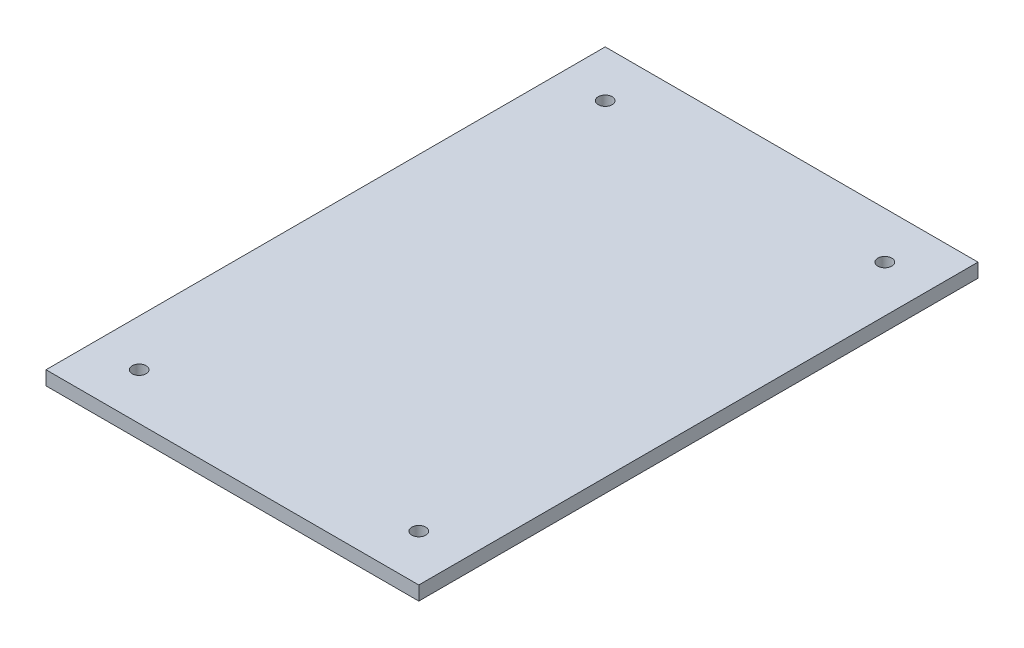
ISO-10303-21;
HEADER;
FILE_DESCRIPTION(('STEP AP214'),'2;1');
FILE_NAME('part.step','',(''),(''),'','','');
FILE_SCHEMA(('AUTOMOTIVE_DESIGN { 1 0 10303 214 1 1 1 1 }'));
ENDSEC;
DATA;
#1=APPLICATION_CONTEXT('core data for automotive mechanical design processes');
#2=APPLICATION_PROTOCOL_DEFINITION('international standard','automotive_design',2000,#1);
#3=PRODUCT_CONTEXT('',#1,'mechanical');
#4=PRODUCT('Part','Part','',(#3));
#5=PRODUCT_RELATED_PRODUCT_CATEGORY('part','',(#4));
#6=PRODUCT_DEFINITION_FORMATION('','',#4);
#7=PRODUCT_DEFINITION_CONTEXT('part definition',#1,'design');
#8=PRODUCT_DEFINITION('design','',#6,#7);
#9=PRODUCT_DEFINITION_SHAPE('','',#8);
#10=(LENGTH_UNIT() NAMED_UNIT(*) SI_UNIT(.MILLI.,.METRE.));
#11=(NAMED_UNIT(*) PLANE_ANGLE_UNIT() SI_UNIT($,.RADIAN.));
#12=(NAMED_UNIT(*) SI_UNIT($,.STERADIAN.) SOLID_ANGLE_UNIT());
#13=UNCERTAINTY_MEASURE_WITH_UNIT(LENGTH_MEASURE(1.E-05),#10,'distance_accuracy_value','');
#14=(GEOMETRIC_REPRESENTATION_CONTEXT(3) GLOBAL_UNCERTAINTY_ASSIGNED_CONTEXT((#13)) GLOBAL_UNIT_ASSIGNED_CONTEXT((#10,
#11,#12)) REPRESENTATION_CONTEXT('',''));
#15=CARTESIAN_POINT('',(0.,0.,0.));
#16=DIRECTION('',(0.,0.,1.));
#17=DIRECTION('',(1.,0.,0.));
#18=AXIS2_PLACEMENT_3D('',#15,#16,#17);
#19=CARTESIAN_POINT('',(-40.,3.,60.));
#20=DIRECTION('',(1.,0.,0.));
#21=DIRECTION('',(0.,0.,-1.));
#22=AXIS2_PLACEMENT_3D('',#19,#20,#21);
#23=PLANE('',#22);
#24=DIRECTION('',(0.,0.,1.));
#25=VECTOR('',#24,1.);
#26=CARTESIAN_POINT('',(-40.,0.,60.));
#27=LINE('',#26,#25);
#28=CARTESIAN_POINT('',(-40.,0.,-60.));
#29=VERTEX_POINT('',#28);
#30=CARTESIAN_POINT('',(-40.,0.,60.));
#31=VERTEX_POINT('',#30);
#32=EDGE_CURVE('E98',#29,#31,#27,.T.);
#33=ORIENTED_EDGE('',*,*,#32,.T.);
#34=DIRECTION('',(0.,-1.,0.));
#35=VECTOR('',#34,1.);
#36=CARTESIAN_POINT('',(-40.,3.,60.));
#37=LINE('',#36,#35);
#38=CARTESIAN_POINT('',(-40.,3.,60.));
#39=VERTEX_POINT('',#38);
#40=EDGE_CURVE('E11',#39,#31,#37,.T.);
#41=ORIENTED_EDGE('',*,*,#40,.F.);
#42=DIRECTION('',(0.,0.,1.));
#43=VECTOR('',#42,1.);
#44=CARTESIAN_POINT('',(-40.,3.,60.));
#45=LINE('',#44,#43);
#46=CARTESIAN_POINT('',(-40.,3.,-60.));
#47=VERTEX_POINT('',#46);
#48=EDGE_CURVE('E86',#47,#39,#45,.T.);
#49=ORIENTED_EDGE('',*,*,#48,.F.);
#50=DIRECTION('',(0.,-1.,0.));
#51=VECTOR('',#50,1.);
#52=CARTESIAN_POINT('',(-40.,3.,-60.));
#53=LINE('',#52,#51);
#54=EDGE_CURVE('E94',#47,#29,#53,.T.);
#55=ORIENTED_EDGE('',*,*,#54,.T.);
#56=EDGE_LOOP('',(#33,#41,#49,#55));
#57=FACE_BOUND('',#56,.T.);
#58=ADVANCED_FACE('F35',(#57),#23,.F.);
#59=CARTESIAN_POINT('',(40.,3.,60.));
#60=DIRECTION('',(0.,0.,-1.));
#61=DIRECTION('',(-1.,0.,0.));
#62=AXIS2_PLACEMENT_3D('',#59,#60,#61);
#63=PLANE('',#62);
#64=DIRECTION('',(1.,0.,0.));
#65=VECTOR('',#64,1.);
#66=CARTESIAN_POINT('',(40.,0.,60.));
#67=LINE('',#66,#65);
#68=CARTESIAN_POINT('',(40.,0.,60.));
#69=VERTEX_POINT('',#68);
#70=EDGE_CURVE('E90',#31,#69,#67,.T.);
#71=ORIENTED_EDGE('',*,*,#70,.T.);
#72=DIRECTION('',(0.,-1.,0.));
#73=VECTOR('',#72,1.);
#74=CARTESIAN_POINT('',(40.,3.,60.));
#75=LINE('',#74,#73);
#76=CARTESIAN_POINT('',(40.,3.,60.));
#77=VERTEX_POINT('',#76);
#78=EDGE_CURVE('E43',#77,#69,#75,.T.);
#79=ORIENTED_EDGE('',*,*,#78,.F.);
#80=DIRECTION('',(1.,0.,0.));
#81=VECTOR('',#80,1.);
#82=CARTESIAN_POINT('',(40.,3.,60.));
#83=LINE('',#82,#81);
#84=EDGE_CURVE('E81',#39,#77,#83,.T.);
#85=ORIENTED_EDGE('',*,*,#84,.F.);
#86=ORIENTED_EDGE('',*,*,#40,.T.);
#87=EDGE_LOOP('',(#71,#79,#85,#86));
#88=FACE_BOUND('',#87,.T.);
#89=ADVANCED_FACE('F89',(#88),#63,.F.);
#90=CARTESIAN_POINT('',(40.,3.,60.));
#91=DIRECTION('',(-1.,0.,0.));
#92=DIRECTION('',(0.,0.,1.));
#93=AXIS2_PLACEMENT_3D('',#90,#91,#92);
#94=PLANE('',#93);
#95=DIRECTION('',(0.,0.,-1.));
#96=VECTOR('',#95,1.);
#97=CARTESIAN_POINT('',(40.,0.,60.));
#98=LINE('',#97,#96);
#99=CARTESIAN_POINT('',(40.,0.,-60.));
#100=VERTEX_POINT('',#99);
#101=EDGE_CURVE('E68',#69,#100,#98,.T.);
#102=ORIENTED_EDGE('',*,*,#101,.T.);
#103=DIRECTION('',(0.,-1.,0.));
#104=VECTOR('',#103,1.);
#105=CARTESIAN_POINT('',(40.,3.,-60.));
#106=LINE('',#105,#104);
#107=CARTESIAN_POINT('',(40.,3.,-60.));
#108=VERTEX_POINT('',#107);
#109=EDGE_CURVE('E91',#108,#100,#106,.T.);
#110=ORIENTED_EDGE('',*,*,#109,.F.);
#111=DIRECTION('',(0.,0.,-1.));
#112=VECTOR('',#111,1.);
#113=CARTESIAN_POINT('',(40.,3.,60.));
#114=LINE('',#113,#112);
#115=EDGE_CURVE('E84',#77,#108,#114,.T.);
#116=ORIENTED_EDGE('',*,*,#115,.F.);
#117=ORIENTED_EDGE('',*,*,#78,.T.);
#118=EDGE_LOOP('',(#102,#110,#116,#117));
#119=FACE_BOUND('',#118,.T.);
#120=ADVANCED_FACE('F92',(#119),#94,.F.);
#121=CARTESIAN_POINT('',(40.,3.,-60.));
#122=DIRECTION('',(0.,0.,1.));
#123=DIRECTION('',(1.,0.,0.));
#124=AXIS2_PLACEMENT_3D('',#121,#122,#123);
#125=PLANE('',#124);
#126=DIRECTION('',(-1.,0.,0.));
#127=VECTOR('',#126,1.);
#128=CARTESIAN_POINT('',(40.,0.,-60.));
#129=LINE('',#128,#127);
#130=EDGE_CURVE('E74',#100,#29,#129,.T.);
#131=ORIENTED_EDGE('',*,*,#130,.T.);
#132=ORIENTED_EDGE('',*,*,#54,.F.);
#133=DIRECTION('',(-1.,0.,0.));
#134=VECTOR('',#133,1.);
#135=CARTESIAN_POINT('',(40.,3.,-60.));
#136=LINE('',#135,#134);
#137=EDGE_CURVE('E51',#108,#47,#136,.T.);
#138=ORIENTED_EDGE('',*,*,#137,.F.);
#139=ORIENTED_EDGE('',*,*,#109,.T.);
#140=EDGE_LOOP('',(#131,#132,#138,#139));
#141=FACE_BOUND('',#140,.T.);
#142=ADVANCED_FACE('F106',(#141),#125,.F.);
#143=CARTESIAN_POINT('',(0.,3.,0.));
#144=DIRECTION('',(0.,1.,0.));
#145=DIRECTION('',(0.,0.,1.));
#146=AXIS2_PLACEMENT_3D('',#143,#144,#145);
#147=PLANE('',#146);
#148=CARTESIAN_POINT('',(-30.,3.,-50.));
#149=DIRECTION('',(0.,1.,0.));
#150=DIRECTION('',(0.,0.,-1.));
#151=AXIS2_PLACEMENT_3D('',#148,#149,#150);
#152=CIRCLE('',#151,1.5);
#153=CARTESIAN_POINT('',(-30.,3.,-51.5));
#154=VERTEX_POINT('',#153);
#155=EDGE_CURVE('E130',#154,#154,#152,.T.);
#156=ORIENTED_EDGE('',*,*,#155,.F.);
#157=EDGE_LOOP('',(#156));
#158=FACE_BOUND('',#157,.T.);
#159=CARTESIAN_POINT('',(30.,3.,-50.));
#160=DIRECTION('',(0.,1.,0.));
#161=DIRECTION('',(0.,0.,1.));
#162=AXIS2_PLACEMENT_3D('',#159,#160,#161);
#163=CIRCLE('',#162,1.5);
#164=CARTESIAN_POINT('',(30.,3.,-48.5));
#165=VERTEX_POINT('',#164);
#166=EDGE_CURVE('E124',#165,#165,#163,.T.);
#167=ORIENTED_EDGE('',*,*,#166,.F.);
#168=EDGE_LOOP('',(#167));
#169=FACE_BOUND('',#168,.T.);
#170=CARTESIAN_POINT('',(30.,3.,50.));
#171=DIRECTION('',(0.,1.,0.));
#172=DIRECTION('',(0.,0.,-1.));
#173=AXIS2_PLACEMENT_3D('',#170,#171,#172);
#174=CIRCLE('',#173,1.5);
#175=CARTESIAN_POINT('',(30.,3.,48.5));
#176=VERTEX_POINT('',#175);
#177=EDGE_CURVE('E118',#176,#176,#174,.T.);
#178=ORIENTED_EDGE('',*,*,#177,.F.);
#179=EDGE_LOOP('',(#178));
#180=FACE_BOUND('',#179,.T.);
#181=CARTESIAN_POINT('',(-30.,3.,50.));
#182=DIRECTION('',(0.,1.,0.));
#183=DIRECTION('',(0.,0.,1.));
#184=AXIS2_PLACEMENT_3D('',#181,#182,#183);
#185=CIRCLE('',#184,1.5);
#186=CARTESIAN_POINT('',(-30.,3.,51.5));
#187=VERTEX_POINT('',#186);
#188=EDGE_CURVE('E112',#187,#187,#185,.T.);
#189=ORIENTED_EDGE('',*,*,#188,.F.);
#190=EDGE_LOOP('',(#189));
#191=FACE_BOUND('',#190,.T.);
#192=ORIENTED_EDGE('',*,*,#48,.T.);
#193=ORIENTED_EDGE('',*,*,#84,.T.);
#194=ORIENTED_EDGE('',*,*,#115,.T.);
#195=ORIENTED_EDGE('',*,*,#137,.T.);
#196=EDGE_LOOP('',(#192,#193,#194,#195));
#197=FACE_BOUND('',#196,.T.);
#198=ADVANCED_FACE('F82',(#158,#169,#180,#191,#197),#147,.T.);
#199=CARTESIAN_POINT('',(0.,0.,0.));
#200=DIRECTION('',(0.,1.,0.));
#201=DIRECTION('',(0.,0.,1.));
#202=AXIS2_PLACEMENT_3D('',#199,#200,#201);
#203=PLANE('',#202);
#204=CARTESIAN_POINT('',(-30.,0.,-50.));
#205=DIRECTION('',(0.,1.,0.));
#206=DIRECTION('',(0.,0.,-1.));
#207=AXIS2_PLACEMENT_3D('',#204,#205,#206);
#208=CIRCLE('',#207,1.5);
#209=CARTESIAN_POINT('',(-30.,0.,-51.5));
#210=VERTEX_POINT('',#209);
#211=EDGE_CURVE('E127',#210,#210,#208,.T.);
#212=ORIENTED_EDGE('',*,*,#211,.T.);
#213=EDGE_LOOP('',(#212));
#214=FACE_BOUND('',#213,.T.);
#215=CARTESIAN_POINT('',(30.,0.,-50.));
#216=DIRECTION('',(0.,1.,0.));
#217=DIRECTION('',(0.,0.,1.));
#218=AXIS2_PLACEMENT_3D('',#215,#216,#217);
#219=CIRCLE('',#218,1.5);
#220=CARTESIAN_POINT('',(30.,0.,-48.5));
#221=VERTEX_POINT('',#220);
#222=EDGE_CURVE('E121',#221,#221,#219,.T.);
#223=ORIENTED_EDGE('',*,*,#222,.T.);
#224=EDGE_LOOP('',(#223));
#225=FACE_BOUND('',#224,.T.);
#226=CARTESIAN_POINT('',(30.,0.,50.));
#227=DIRECTION('',(0.,1.,0.));
#228=DIRECTION('',(0.,0.,-1.));
#229=AXIS2_PLACEMENT_3D('',#226,#227,#228);
#230=CIRCLE('',#229,1.5);
#231=CARTESIAN_POINT('',(30.,0.,48.5));
#232=VERTEX_POINT('',#231);
#233=EDGE_CURVE('E115',#232,#232,#230,.T.);
#234=ORIENTED_EDGE('',*,*,#233,.T.);
#235=EDGE_LOOP('',(#234));
#236=FACE_BOUND('',#235,.T.);
#237=CARTESIAN_POINT('',(-30.,0.,50.));
#238=DIRECTION('',(0.,1.,0.));
#239=DIRECTION('',(0.,0.,1.));
#240=AXIS2_PLACEMENT_3D('',#237,#238,#239);
#241=CIRCLE('',#240,1.5);
#242=CARTESIAN_POINT('',(-30.,0.,51.5));
#243=VERTEX_POINT('',#242);
#244=EDGE_CURVE('E101',#243,#243,#241,.T.);
#245=ORIENTED_EDGE('',*,*,#244,.T.);
#246=EDGE_LOOP('',(#245));
#247=FACE_BOUND('',#246,.T.);
#248=ORIENTED_EDGE('',*,*,#32,.F.);
#249=ORIENTED_EDGE('',*,*,#130,.F.);
#250=ORIENTED_EDGE('',*,*,#101,.F.);
#251=ORIENTED_EDGE('',*,*,#70,.F.);
#252=EDGE_LOOP('',(#248,#249,#250,#251));
#253=FACE_BOUND('',#252,.T.);
#254=ADVANCED_FACE('F109',(#214,#225,#236,#247,#253),#203,.F.);
#255=CARTESIAN_POINT('',(-30.,0.,50.));
#256=DIRECTION('',(0.,1.,0.));
#257=DIRECTION('',(0.,0.,1.));
#258=AXIS2_PLACEMENT_3D('',#255,#256,#257);
#259=CYLINDRICAL_SURFACE('',#258,1.5);
#260=ORIENTED_EDGE('',*,*,#244,.F.);
#261=EDGE_LOOP('',(#260));
#262=FACE_BOUND('',#261,.T.);
#263=ORIENTED_EDGE('',*,*,#188,.T.);
#264=EDGE_LOOP('',(#263));
#265=FACE_BOUND('',#264,.T.);
#266=ADVANCED_FACE('F154',(#262,#265),#259,.F.);
#267=CARTESIAN_POINT('',(30.,0.,50.));
#268=DIRECTION('',(0.,1.,0.));
#269=DIRECTION('',(0.,0.,1.));
#270=AXIS2_PLACEMENT_3D('',#267,#268,#269);
#271=CYLINDRICAL_SURFACE('',#270,1.5);
#272=ORIENTED_EDGE('',*,*,#233,.F.);
#273=EDGE_LOOP('',(#272));
#274=FACE_BOUND('',#273,.T.);
#275=ORIENTED_EDGE('',*,*,#177,.T.);
#276=EDGE_LOOP('',(#275));
#277=FACE_BOUND('',#276,.T.);
#278=ADVANCED_FACE('F156',(#274,#277),#271,.F.);
#279=CARTESIAN_POINT('',(30.,0.,-50.));
#280=DIRECTION('',(0.,1.,0.));
#281=DIRECTION('',(0.,0.,1.));
#282=AXIS2_PLACEMENT_3D('',#279,#280,#281);
#283=CYLINDRICAL_SURFACE('',#282,1.5);
#284=ORIENTED_EDGE('',*,*,#222,.F.);
#285=EDGE_LOOP('',(#284));
#286=FACE_BOUND('',#285,.T.);
#287=ORIENTED_EDGE('',*,*,#166,.T.);
#288=EDGE_LOOP('',(#287));
#289=FACE_BOUND('',#288,.T.);
#290=ADVANCED_FACE('F141',(#286,#289),#283,.F.);
#291=CARTESIAN_POINT('',(-30.,0.,-50.));
#292=DIRECTION('',(0.,1.,0.));
#293=DIRECTION('',(0.,0.,1.));
#294=AXIS2_PLACEMENT_3D('',#291,#292,#293);
#295=CYLINDRICAL_SURFACE('',#294,1.5);
#296=ORIENTED_EDGE('',*,*,#211,.F.);
#297=EDGE_LOOP('',(#296));
#298=FACE_BOUND('',#297,.T.);
#299=ORIENTED_EDGE('',*,*,#155,.T.);
#300=EDGE_LOOP('',(#299));
#301=FACE_BOUND('',#300,.T.);
#302=ADVANCED_FACE('F138',(#298,#301),#295,.F.);
#303=CLOSED_SHELL('',(#58,#89,#120,#142,#198,#254,#266,#278,#290,#302));
#304=MANIFOLD_SOLID_BREP('B2',#303);
#305=ADVANCED_BREP_SHAPE_REPRESENTATION('',(#18,#304),#14);
#306=SHAPE_DEFINITION_REPRESENTATION(#9,#305);
ENDSEC;
END-ISO-10303-21;
